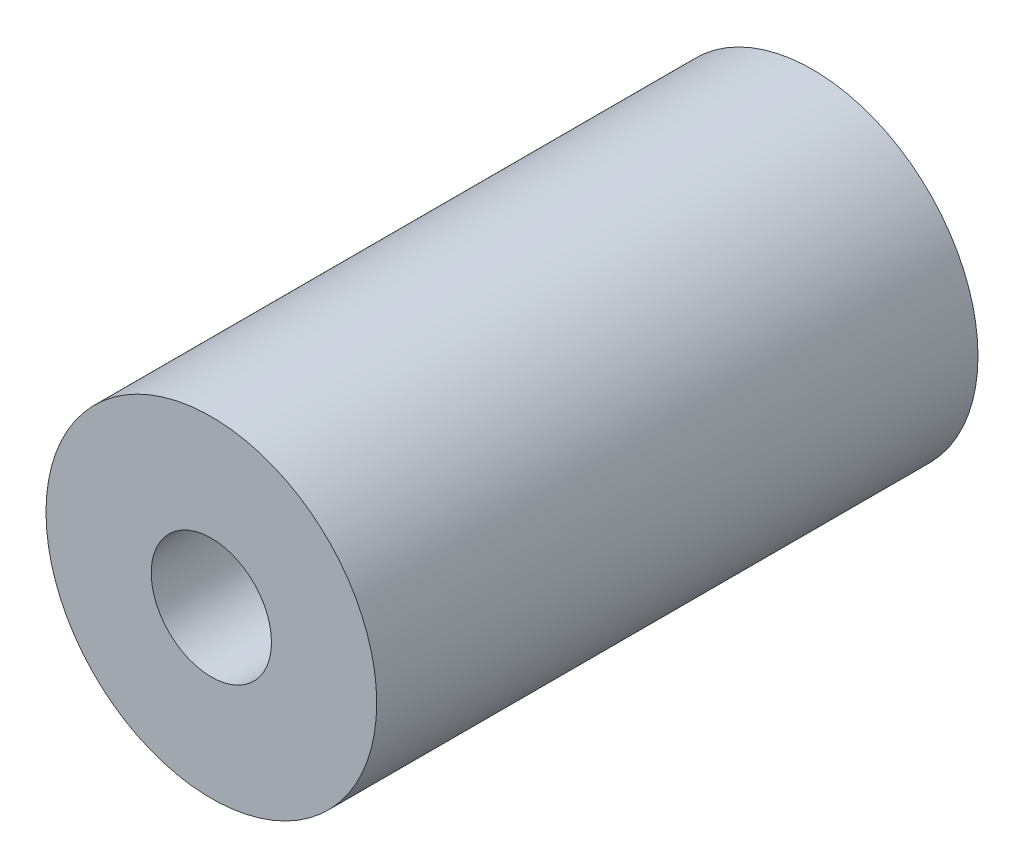
ISO-10303-21;
HEADER;
FILE_DESCRIPTION(('STEP AP214'),'2;1');
FILE_NAME('part.step','',(''),(''),'','','');
FILE_SCHEMA(('AUTOMOTIVE_DESIGN { 1 0 10303 214 1 1 1 1 }'));
ENDSEC;
DATA;
#1=APPLICATION_CONTEXT('core data for automotive mechanical design processes');
#2=APPLICATION_PROTOCOL_DEFINITION('international standard','automotive_design',2000,#1);
#3=PRODUCT_CONTEXT('',#1,'mechanical');
#4=PRODUCT('Part','Part','',(#3));
#5=PRODUCT_RELATED_PRODUCT_CATEGORY('part','',(#4));
#6=PRODUCT_DEFINITION_FORMATION('','',#4);
#7=PRODUCT_DEFINITION_CONTEXT('part definition',#1,'design');
#8=PRODUCT_DEFINITION('design','',#6,#7);
#9=PRODUCT_DEFINITION_SHAPE('','',#8);
#10=(LENGTH_UNIT() NAMED_UNIT(*) SI_UNIT(.MILLI.,.METRE.));
#11=(NAMED_UNIT(*) PLANE_ANGLE_UNIT() SI_UNIT($,.RADIAN.));
#12=(NAMED_UNIT(*) SI_UNIT($,.STERADIAN.) SOLID_ANGLE_UNIT());
#13=UNCERTAINTY_MEASURE_WITH_UNIT(LENGTH_MEASURE(1.E-05),#10,'distance_accuracy_value','');
#14=(GEOMETRIC_REPRESENTATION_CONTEXT(3) GLOBAL_UNCERTAINTY_ASSIGNED_CONTEXT((#13)) GLOBAL_UNIT_ASSIGNED_CONTEXT((#10,
#11,#12)) REPRESENTATION_CONTEXT('',''));
#15=CARTESIAN_POINT('',(0.,0.,0.));
#16=DIRECTION('',(0.,0.,1.));
#17=DIRECTION('',(1.,0.,0.));
#18=AXIS2_PLACEMENT_3D('',#15,#16,#17);
#19=CARTESIAN_POINT('',(0.,0.,25.4));
#20=DIRECTION('',(0.,0.,1.));
#21=DIRECTION('',(1.,0.,0.));
#22=AXIS2_PLACEMENT_3D('',#19,#20,#21);
#23=PLANE('',#22);
#24=CARTESIAN_POINT('',(0.,0.,25.4));
#25=DIRECTION('',(0.,0.,1.));
#26=DIRECTION('',(1.,0.,0.));
#27=AXIS2_PLACEMENT_3D('',#24,#25,#26);
#28=CIRCLE('',#27,6.985);
#29=CARTESIAN_POINT('',(6.985,0.,25.4));
#30=VERTEX_POINT('',#29);
#31=EDGE_CURVE('E10',#30,#30,#28,.T.);
#32=ORIENTED_EDGE('',*,*,#31,.T.);
#33=EDGE_LOOP('',(#32));
#34=FACE_BOUND('',#33,.T.);
#35=CARTESIAN_POINT('',(0.,0.,25.4));
#36=DIRECTION('',(0.,0.,1.));
#37=DIRECTION('',(1.,0.,0.));
#38=AXIS2_PLACEMENT_3D('',#35,#36,#37);
#39=CIRCLE('',#38,2.54);
#40=CARTESIAN_POINT('',(2.54,0.,25.4));
#41=VERTEX_POINT('',#40);
#42=EDGE_CURVE('E42',#41,#41,#39,.T.);
#43=ORIENTED_EDGE('',*,*,#42,.F.);
#44=EDGE_LOOP('',(#43));
#45=FACE_BOUND('',#44,.T.);
#46=ADVANCED_FACE('F31',(#34,#45),#23,.T.);
#47=CARTESIAN_POINT('',(0.,0.,0.));
#48=DIRECTION('',(0.,0.,1.));
#49=DIRECTION('',(1.,0.,0.));
#50=AXIS2_PLACEMENT_3D('',#47,#48,#49);
#51=PLANE('',#50);
#52=CARTESIAN_POINT('',(0.,0.,0.));
#53=DIRECTION('',(0.,0.,1.));
#54=DIRECTION('',(1.,0.,0.));
#55=AXIS2_PLACEMENT_3D('',#52,#53,#54);
#56=CIRCLE('',#55,6.985);
#57=CARTESIAN_POINT('',(6.985,0.,0.));
#58=VERTEX_POINT('',#57);
#59=EDGE_CURVE('E35',#58,#58,#56,.T.);
#60=ORIENTED_EDGE('',*,*,#59,.F.);
#61=EDGE_LOOP('',(#60));
#62=FACE_BOUND('',#61,.T.);
#63=CARTESIAN_POINT('',(0.,0.,0.));
#64=DIRECTION('',(0.,0.,1.));
#65=DIRECTION('',(1.,0.,0.));
#66=AXIS2_PLACEMENT_3D('',#63,#64,#65);
#67=CIRCLE('',#66,2.54);
#68=CARTESIAN_POINT('',(2.54,0.,0.));
#69=VERTEX_POINT('',#68);
#70=EDGE_CURVE('E44',#69,#69,#67,.T.);
#71=ORIENTED_EDGE('',*,*,#70,.T.);
#72=EDGE_LOOP('',(#71));
#73=FACE_BOUND('',#72,.T.);
#74=ADVANCED_FACE('F54',(#62,#73),#51,.F.);
#75=CARTESIAN_POINT('',(0.,0.,25.4));
#76=DIRECTION('',(0.,0.,-1.));
#77=DIRECTION('',(-1.,0.,0.));
#78=AXIS2_PLACEMENT_3D('',#75,#76,#77);
#79=CYLINDRICAL_SURFACE('',#78,6.985);
#80=ORIENTED_EDGE('',*,*,#31,.F.);
#81=EDGE_LOOP('',(#80));
#82=FACE_BOUND('',#81,.T.);
#83=ORIENTED_EDGE('',*,*,#59,.T.);
#84=EDGE_LOOP('',(#83));
#85=FACE_BOUND('',#84,.T.);
#86=ADVANCED_FACE('F33',(#82,#85),#79,.T.);
#87=CARTESIAN_POINT('',(0.,0.,25.4));
#88=DIRECTION('',(0.,0.,-1.));
#89=DIRECTION('',(-1.,0.,0.));
#90=AXIS2_PLACEMENT_3D('',#87,#88,#89);
#91=CYLINDRICAL_SURFACE('',#90,2.54);
#92=ORIENTED_EDGE('',*,*,#42,.T.);
#93=EDGE_LOOP('',(#92));
#94=FACE_BOUND('',#93,.T.);
#95=ORIENTED_EDGE('',*,*,#70,.F.);
#96=EDGE_LOOP('',(#95));
#97=FACE_BOUND('',#96,.T.);
#98=ADVANCED_FACE('F50',(#94,#97),#91,.F.);
#99=CLOSED_SHELL('',(#46,#74,#86,#98));
#100=MANIFOLD_SOLID_BREP('B2',#99);
#101=ADVANCED_BREP_SHAPE_REPRESENTATION('',(#18,#100),#14);
#102=SHAPE_DEFINITION_REPRESENTATION(#9,#101);
ENDSEC;
END-ISO-10303-21;
